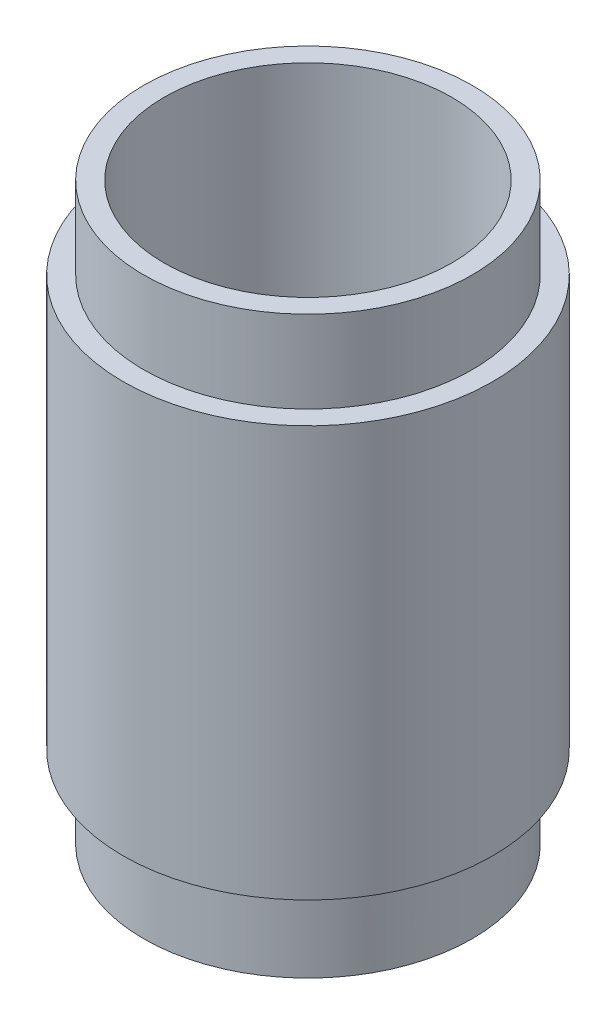
ISO-10303-21;
HEADER;
FILE_DESCRIPTION(('STEP AP214'),'2;1');
FILE_NAME('part.step','',(''),(''),'','','');
FILE_SCHEMA(('AUTOMOTIVE_DESIGN { 1 0 10303 214 1 1 1 1 }'));
ENDSEC;
DATA;
#1=APPLICATION_CONTEXT('core data for automotive mechanical design processes');
#2=APPLICATION_PROTOCOL_DEFINITION('international standard','automotive_design',2000,#1);
#3=PRODUCT_CONTEXT('',#1,'mechanical');
#4=PRODUCT('Part','Part','',(#3));
#5=PRODUCT_RELATED_PRODUCT_CATEGORY('part','',(#4));
#6=PRODUCT_DEFINITION_FORMATION('','',#4);
#7=PRODUCT_DEFINITION_CONTEXT('part definition',#1,'design');
#8=PRODUCT_DEFINITION('design','',#6,#7);
#9=PRODUCT_DEFINITION_SHAPE('','',#8);
#10=(LENGTH_UNIT() NAMED_UNIT(*) SI_UNIT(.MILLI.,.METRE.));
#11=(NAMED_UNIT(*) PLANE_ANGLE_UNIT() SI_UNIT($,.RADIAN.));
#12=(NAMED_UNIT(*) SI_UNIT($,.STERADIAN.) SOLID_ANGLE_UNIT());
#13=UNCERTAINTY_MEASURE_WITH_UNIT(LENGTH_MEASURE(1.E-05),#10,'distance_accuracy_value','');
#14=(GEOMETRIC_REPRESENTATION_CONTEXT(3) GLOBAL_UNCERTAINTY_ASSIGNED_CONTEXT((#13)) GLOBAL_UNIT_ASSIGNED_CONTEXT((#10,
#11,#12)) REPRESENTATION_CONTEXT('',''));
#15=CARTESIAN_POINT('',(0.,0.,0.));
#16=DIRECTION('',(0.,0.,1.));
#17=DIRECTION('',(1.,0.,0.));
#18=AXIS2_PLACEMENT_3D('',#15,#16,#17);
#19=CARTESIAN_POINT('',(0.,600.999999999999,0.));
#20=DIRECTION('',(0.,1.,0.));
#21=DIRECTION('',(0.,0.,1.));
#22=AXIS2_PLACEMENT_3D('',#19,#20,#21);
#23=PLANE('',#22);
#24=CARTESIAN_POINT('',(0.,600.999999999999,0.));
#25=DIRECTION('',(0.,1.,0.));
#26=DIRECTION('',(0.,0.,1.));
#27=AXIS2_PLACEMENT_3D('',#24,#25,#26);
#28=CIRCLE('',#27,45.);
#29=CARTESIAN_POINT('',(0.,600.999999999999,45.));
#30=VERTEX_POINT('',#29);
#31=EDGE_CURVE('E73',#30,#30,#28,.T.);
#32=ORIENTED_EDGE('',*,*,#31,.F.);
#33=EDGE_LOOP('',(#32));
#34=FACE_BOUND('',#33,.T.);
#35=CARTESIAN_POINT('',(1.08622393999956E-12,600.999999999999,0.));
#36=DIRECTION('',(0.,1.,0.));
#37=DIRECTION('',(0.,0.,1.));
#38=AXIS2_PLACEMENT_3D('',#35,#36,#37);
#39=CIRCLE('',#38,39.999999999999);
#40=CARTESIAN_POINT('',(1.08622393999956E-12,600.999999999999,39.999999999999));
#41=VERTEX_POINT('',#40);
#42=EDGE_CURVE('E11',#41,#41,#39,.F.);
#43=ORIENTED_EDGE('',*,*,#42,.F.);
#44=EDGE_LOOP('',(#43));
#45=FACE_BOUND('',#44,.T.);
#46=ADVANCED_FACE('F61',(#34,#45),#23,.F.);
#47=CARTESIAN_POINT('',(0.,700.999999999999,0.));
#48=DIRECTION('',(0.,1.,0.));
#49=DIRECTION('',(0.,0.,1.));
#50=AXIS2_PLACEMENT_3D('',#47,#48,#49);
#51=PLANE('',#50);
#52=CARTESIAN_POINT('',(0.,700.999999999999,0.));
#53=DIRECTION('',(0.,1.,0.));
#54=DIRECTION('',(0.,0.,1.));
#55=AXIS2_PLACEMENT_3D('',#52,#53,#54);
#56=CIRCLE('',#55,45.);
#57=CARTESIAN_POINT('',(0.,700.999999999999,45.));
#58=VERTEX_POINT('',#57);
#59=EDGE_CURVE('E68',#58,#58,#56,.T.);
#60=ORIENTED_EDGE('',*,*,#59,.T.);
#61=EDGE_LOOP('',(#60));
#62=FACE_BOUND('',#61,.T.);
#63=CARTESIAN_POINT('',(1.26696003650532E-12,700.999999999999,0.));
#64=DIRECTION('',(0.,1.,0.));
#65=DIRECTION('',(-1.,0.,0.));
#66=AXIS2_PLACEMENT_3D('',#63,#64,#65);
#67=CIRCLE('',#66,39.9999999999988);
#68=CARTESIAN_POINT('',(-39.9999999999975,701.,0.));
#69=VERTEX_POINT('',#68);
#70=EDGE_CURVE('E81',#69,#69,#67,.T.);
#71=ORIENTED_EDGE('',*,*,#70,.F.);
#72=EDGE_LOOP('',(#71));
#73=FACE_BOUND('',#72,.T.);
#74=ADVANCED_FACE('F120',(#62,#73),#51,.T.);
#75=CARTESIAN_POINT('',(0.,600.999999999999,0.));
#76=DIRECTION('',(0.,1.,0.));
#77=DIRECTION('',(0.,0.,1.));
#78=AXIS2_PLACEMENT_3D('',#75,#76,#77);
#79=CYLINDRICAL_SURFACE('',#78,45.);
#80=ORIENTED_EDGE('',*,*,#31,.T.);
#81=EDGE_LOOP('',(#80));
#82=FACE_BOUND('',#81,.T.);
#83=ORIENTED_EDGE('',*,*,#59,.F.);
#84=EDGE_LOOP('',(#83));
#85=FACE_BOUND('',#84,.T.);
#86=ADVANCED_FACE('F125',(#82,#85),#79,.T.);
#87=CARTESIAN_POINT('',(0.,600.999999999999,0.));
#88=DIRECTION('',(0.,1.,0.));
#89=DIRECTION('',(0.,0.,1.));
#90=AXIS2_PLACEMENT_3D('',#87,#88,#89);
#91=CYLINDRICAL_SURFACE('',#90,35.);
#92=CARTESIAN_POINT('',(1.30310725580647E-12,720.999999999999,0.));
#93=DIRECTION('',(0.,1.,0.));
#94=DIRECTION('',(-1.,0.,0.));
#95=AXIS2_PLACEMENT_3D('',#92,#93,#94);
#96=CIRCLE('',#95,34.9999999999988);
#97=CARTESIAN_POINT('',(-34.9999999999975,721.,0.));
#98=VERTEX_POINT('',#97);
#99=EDGE_CURVE('E85',#98,#98,#96,.T.);
#100=ORIENTED_EDGE('',*,*,#99,.T.);
#101=EDGE_LOOP('',(#100));
#102=FACE_BOUND('',#101,.T.);
#103=CARTESIAN_POINT('',(1.05007672069841E-12,580.999999999999,0.));
#104=DIRECTION('',(0.,-1.,0.));
#105=DIRECTION('',(1.,0.,0.));
#106=AXIS2_PLACEMENT_3D('',#103,#104,#105);
#107=CIRCLE('',#106,34.999999999999);
#108=CARTESIAN_POINT('',(35.,580.999999999999,0.));
#109=VERTEX_POINT('',#108);
#110=EDGE_CURVE('E96',#109,#109,#107,.T.);
#111=ORIENTED_EDGE('',*,*,#110,.T.);
#112=EDGE_LOOP('',(#111));
#113=FACE_BOUND('',#112,.T.);
#114=ADVANCED_FACE('F101',(#102,#113),#91,.F.);
#115=CARTESIAN_POINT('',(1.30310725580647E-12,720.999999999999,0.));
#116=DIRECTION('',(0.,1.,0.));
#117=DIRECTION('',(-1.,0.,0.));
#118=AXIS2_PLACEMENT_3D('',#115,#116,#117);
#119=PLANE('',#118);
#120=CARTESIAN_POINT('',(1.30310725580647E-12,720.999999999999,0.));
#121=DIRECTION('',(0.,1.,0.));
#122=DIRECTION('',(-1.,0.,0.));
#123=AXIS2_PLACEMENT_3D('',#120,#121,#122);
#124=CIRCLE('',#123,39.9999999999988);
#125=CARTESIAN_POINT('',(-39.9999999999975,721.,0.));
#126=VERTEX_POINT('',#125);
#127=EDGE_CURVE('E78',#126,#126,#124,.T.);
#128=ORIENTED_EDGE('',*,*,#127,.T.);
#129=EDGE_LOOP('',(#128));
#130=FACE_BOUND('',#129,.T.);
#131=ORIENTED_EDGE('',*,*,#99,.F.);
#132=EDGE_LOOP('',(#131));
#133=FACE_BOUND('',#132,.T.);
#134=ADVANCED_FACE('F116',(#130,#133),#119,.T.);
#135=CARTESIAN_POINT('',(1.30310725580647E-12,720.999999999999,0.));
#136=DIRECTION('',(0.,-1.,0.));
#137=DIRECTION('',(1.,0.,0.));
#138=AXIS2_PLACEMENT_3D('',#135,#136,#137);
#139=CYLINDRICAL_SURFACE('',#138,39.9999999999988);
#140=ORIENTED_EDGE('',*,*,#127,.F.);
#141=EDGE_LOOP('',(#140));
#142=FACE_BOUND('',#141,.T.);
#143=ORIENTED_EDGE('',*,*,#70,.T.);
#144=EDGE_LOOP('',(#143));
#145=FACE_BOUND('',#144,.T.);
#146=ADVANCED_FACE('F106',(#142,#145),#139,.T.);
#147=CARTESIAN_POINT('',(1.05007672069841E-12,580.999999999999,0.));
#148=DIRECTION('',(0.,-1.,0.));
#149=DIRECTION('',(1.,0.,0.));
#150=AXIS2_PLACEMENT_3D('',#147,#148,#149);
#151=PLANE('',#150);
#152=CARTESIAN_POINT('',(1.05007672069841E-12,580.999999999999,0.));
#153=DIRECTION('',(0.,-1.,0.));
#154=DIRECTION('',(1.,0.,0.));
#155=AXIS2_PLACEMENT_3D('',#152,#153,#154);
#156=CIRCLE('',#155,39.999999999999);
#157=CARTESIAN_POINT('',(40.,580.999999999999,0.));
#158=VERTEX_POINT('',#157);
#159=EDGE_CURVE('E92',#158,#158,#156,.T.);
#160=ORIENTED_EDGE('',*,*,#159,.T.);
#161=EDGE_LOOP('',(#160));
#162=FACE_BOUND('',#161,.T.);
#163=ORIENTED_EDGE('',*,*,#110,.F.);
#164=EDGE_LOOP('',(#163));
#165=FACE_BOUND('',#164,.T.);
#166=ADVANCED_FACE('F103',(#162,#165),#151,.T.);
#167=CARTESIAN_POINT('',(1.05007672069841E-12,580.999999999999,0.));
#168=DIRECTION('',(0.,1.,0.));
#169=DIRECTION('',(-1.,0.,0.));
#170=AXIS2_PLACEMENT_3D('',#167,#168,#169);
#171=CYLINDRICAL_SURFACE('',#170,39.999999999999);
#172=ORIENTED_EDGE('',*,*,#159,.F.);
#173=EDGE_LOOP('',(#172));
#174=FACE_BOUND('',#173,.T.);
#175=ORIENTED_EDGE('',*,*,#42,.T.);
#176=EDGE_LOOP('',(#175));
#177=FACE_BOUND('',#176,.T.);
#178=ADVANCED_FACE('F105',(#174,#177),#171,.T.);
#179=CLOSED_SHELL('',(#46,#74,#86,#114,#134,#146,#166,#178));
#180=MANIFOLD_SOLID_BREP('B2',#179);
#181=ADVANCED_BREP_SHAPE_REPRESENTATION('',(#18,#180),#14);
#182=SHAPE_DEFINITION_REPRESENTATION(#9,#181);
ENDSEC;
END-ISO-10303-21;
